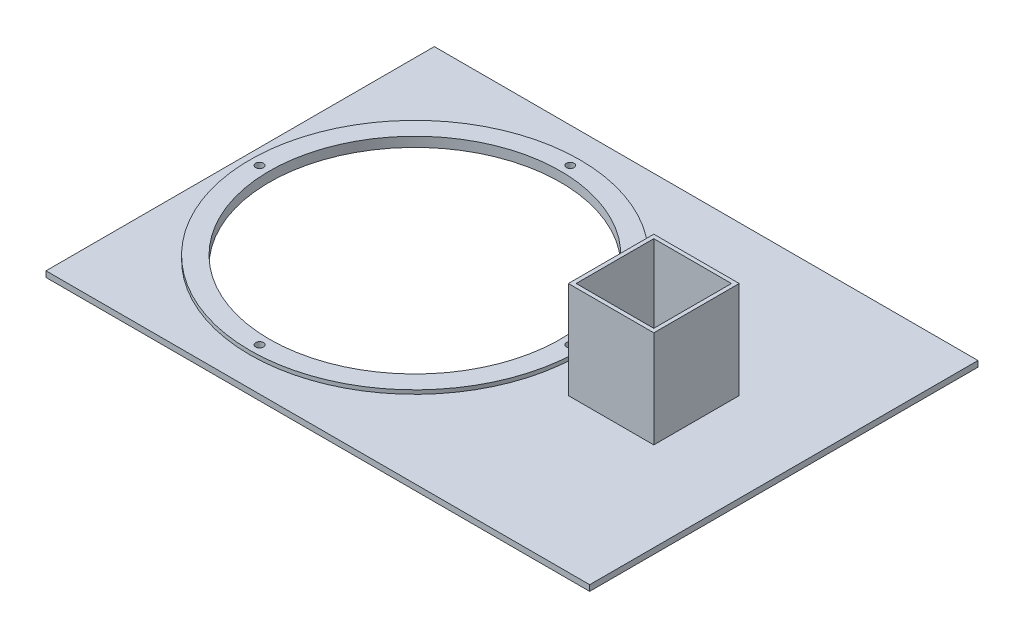
ISO-10303-21;
HEADER;
FILE_DESCRIPTION(('STEP AP214'),'2;1');
FILE_NAME('part.step','',(''),(''),'','','');
FILE_SCHEMA(('AUTOMOTIVE_DESIGN { 1 0 10303 214 1 1 1 1 }'));
ENDSEC;
DATA;
#1=APPLICATION_CONTEXT('core data for automotive mechanical design processes');
#2=APPLICATION_PROTOCOL_DEFINITION('international standard','automotive_design',2000,#1);
#3=PRODUCT_CONTEXT('',#1,'mechanical');
#4=PRODUCT('Part','Part','',(#3));
#5=PRODUCT_RELATED_PRODUCT_CATEGORY('part','',(#4));
#6=PRODUCT_DEFINITION_FORMATION('','',#4);
#7=PRODUCT_DEFINITION_CONTEXT('part definition',#1,'design');
#8=PRODUCT_DEFINITION('design','',#6,#7);
#9=PRODUCT_DEFINITION_SHAPE('','',#8);
#10=(LENGTH_UNIT() NAMED_UNIT(*) SI_UNIT(.MILLI.,.METRE.));
#11=(NAMED_UNIT(*) PLANE_ANGLE_UNIT() SI_UNIT($,.RADIAN.));
#12=(NAMED_UNIT(*) SI_UNIT($,.STERADIAN.) SOLID_ANGLE_UNIT());
#13=UNCERTAINTY_MEASURE_WITH_UNIT(LENGTH_MEASURE(1.E-05),#10,'distance_accuracy_value','');
#14=(GEOMETRIC_REPRESENTATION_CONTEXT(3) GLOBAL_UNCERTAINTY_ASSIGNED_CONTEXT((#13)) GLOBAL_UNIT_ASSIGNED_CONTEXT((#10,
#11,#12)) REPRESENTATION_CONTEXT('',''));
#15=CARTESIAN_POINT('',(0.,0.,0.));
#16=DIRECTION('',(0.,0.,1.));
#17=DIRECTION('',(1.,0.,0.));
#18=AXIS2_PLACEMENT_3D('',#15,#16,#17);
#19=CARTESIAN_POINT('',(0.,3.,0.));
#20=DIRECTION('',(0.,1.,0.));
#21=DIRECTION('',(0.,0.,1.));
#22=AXIS2_PLACEMENT_3D('',#19,#20,#21);
#23=PLANE('',#22);
#24=DIRECTION('',(1.,0.,0.));
#25=VECTOR('',#24,1.);
#26=CARTESIAN_POINT('',(0.,3.,100.));
#27=LINE('',#26,#25);
#28=CARTESIAN_POINT('',(-140.,3.,100.));
#29=VERTEX_POINT('',#28);
#30=CARTESIAN_POINT('',(140.,3.,100.));
#31=VERTEX_POINT('',#30);
#32=EDGE_CURVE('E279',#29,#31,#27,.T.);
#33=ORIENTED_EDGE('',*,*,#32,.T.);
#34=DIRECTION('',(0.,0.,-1.));
#35=VECTOR('',#34,1.);
#36=CARTESIAN_POINT('',(140.,3.,0.));
#37=LINE('',#36,#35);
#38=CARTESIAN_POINT('',(140.,3.,-100.));
#39=VERTEX_POINT('',#38);
#40=EDGE_CURVE('E284',#31,#39,#37,.T.);
#41=ORIENTED_EDGE('',*,*,#40,.T.);
#42=DIRECTION('',(1.,0.,0.));
#43=VECTOR('',#42,1.);
#44=CARTESIAN_POINT('',(0.,3.,-100.));
#45=LINE('',#44,#43);
#46=CARTESIAN_POINT('',(-140.,3.,-100.));
#47=VERTEX_POINT('',#46);
#48=EDGE_CURVE('E287',#47,#39,#45,.T.);
#49=ORIENTED_EDGE('',*,*,#48,.F.);
#50=DIRECTION('',(0.,0.,-1.));
#51=VECTOR('',#50,1.);
#52=CARTESIAN_POINT('',(-140.,3.,0.));
#53=LINE('',#52,#51);
#54=EDGE_CURVE('E291',#29,#47,#53,.T.);
#55=ORIENTED_EDGE('',*,*,#54,.F.);
#56=EDGE_LOOP('',(#33,#41,#49,#55));
#57=FACE_BOUND('',#56,.T.);
#58=CARTESIAN_POINT('',(-50.,3.,0.));
#59=DIRECTION('',(0.,1.,0.));
#60=DIRECTION('',(0.,0.,1.));
#61=AXIS2_PLACEMENT_3D('',#58,#59,#60);
#62=CIRCLE('',#61,85.);
#63=CARTESIAN_POINT('',(-50.,3.,85.));
#64=VERTEX_POINT('',#63);
#65=EDGE_CURVE('E275',#64,#64,#62,.T.);
#66=ORIENTED_EDGE('',*,*,#65,.F.);
#67=EDGE_LOOP('',(#66));
#68=FACE_BOUND('',#67,.T.);
#69=DIRECTION('',(1.,0.,0.));
#70=VECTOR('',#69,1.);
#71=CARTESIAN_POINT('',(50.1750568641056,3.,21.151360474384));
#72=LINE('',#71,#70);
#73=CARTESIAN_POINT('',(50.1750568641056,3.,21.151360474384));
#74=VERTEX_POINT('',#73);
#75=CARTESIAN_POINT('',(94.1750568641056,3.,21.151360474384));
#76=VERTEX_POINT('',#75);
#77=EDGE_CURVE('E210',#74,#76,#72,.T.);
#78=ORIENTED_EDGE('',*,*,#77,.F.);
#79=DIRECTION('',(0.,0.,1.));
#80=VECTOR('',#79,1.);
#81=CARTESIAN_POINT('',(50.1750568641056,3.,21.151360474384));
#82=LINE('',#81,#80);
#83=CARTESIAN_POINT('',(50.1750568641056,3.,-22.848639525616));
#84=VERTEX_POINT('',#83);
#85=EDGE_CURVE('E158',#84,#74,#82,.T.);
#86=ORIENTED_EDGE('',*,*,#85,.F.);
#87=DIRECTION('',(-1.,0.,0.));
#88=VECTOR('',#87,1.);
#89=CARTESIAN_POINT('',(50.1750568641056,3.,-22.848639525616));
#90=LINE('',#89,#88);
#91=CARTESIAN_POINT('',(94.1750568641056,3.,-22.848639525616));
#92=VERTEX_POINT('',#91);
#93=EDGE_CURVE('E197',#92,#84,#90,.T.);
#94=ORIENTED_EDGE('',*,*,#93,.F.);
#95=DIRECTION('',(0.,0.,-1.));
#96=VECTOR('',#95,1.);
#97=CARTESIAN_POINT('',(94.1750568641056,3.,21.151360474384));
#98=LINE('',#97,#96);
#99=EDGE_CURVE('E213',#76,#92,#98,.T.);
#100=ORIENTED_EDGE('',*,*,#99,.F.);
#101=EDGE_LOOP('',(#78,#86,#94,#100));
#102=FACE_BOUND('',#101,.T.);
#103=ADVANCED_FACE('F47',(#57,#68,#102),#23,.T.);
#104=CARTESIAN_POINT('',(0.,3.,100.));
#105=DIRECTION('',(0.,0.,-1.));
#106=DIRECTION('',(-1.,0.,0.));
#107=AXIS2_PLACEMENT_3D('',#104,#105,#106);
#108=PLANE('',#107);
#109=DIRECTION('',(1.,0.,0.));
#110=VECTOR('',#109,1.);
#111=CARTESIAN_POINT('',(0.,0.,100.));
#112=LINE('',#111,#110);
#113=CARTESIAN_POINT('',(-140.,0.,100.));
#114=VERTEX_POINT('',#113);
#115=CARTESIAN_POINT('',(140.,0.,100.));
#116=VERTEX_POINT('',#115);
#117=EDGE_CURVE('E256',#114,#116,#112,.T.);
#118=ORIENTED_EDGE('',*,*,#117,.T.);
#119=DIRECTION('',(0.,-1.,0.));
#120=VECTOR('',#119,1.);
#121=CARTESIAN_POINT('',(140.,3.,100.));
#122=LINE('',#121,#120);
#123=EDGE_CURVE('E11',#31,#116,#122,.T.);
#124=ORIENTED_EDGE('',*,*,#123,.F.);
#125=ORIENTED_EDGE('',*,*,#32,.F.);
#126=DIRECTION('',(0.,-1.,0.));
#127=VECTOR('',#126,1.);
#128=CARTESIAN_POINT('',(-140.,3.,100.));
#129=LINE('',#128,#127);
#130=EDGE_CURVE('E295',#29,#114,#129,.T.);
#131=ORIENTED_EDGE('',*,*,#130,.T.);
#132=EDGE_LOOP('',(#118,#124,#125,#131));
#133=FACE_BOUND('',#132,.T.);
#134=ADVANCED_FACE('F49',(#133),#108,.F.);
#135=CARTESIAN_POINT('',(140.,3.,0.));
#136=DIRECTION('',(-1.,0.,0.));
#137=DIRECTION('',(0.,0.,1.));
#138=AXIS2_PLACEMENT_3D('',#135,#136,#137);
#139=PLANE('',#138);
#140=DIRECTION('',(0.,0.,-1.));
#141=VECTOR('',#140,1.);
#142=CARTESIAN_POINT('',(140.,0.,0.));
#143=LINE('',#142,#141);
#144=CARTESIAN_POINT('',(140.,0.,-100.));
#145=VERTEX_POINT('',#144);
#146=EDGE_CURVE('E299',#116,#145,#143,.T.);
#147=ORIENTED_EDGE('',*,*,#146,.T.);
#148=DIRECTION('',(0.,-1.,0.));
#149=VECTOR('',#148,1.);
#150=CARTESIAN_POINT('',(140.,3.,-100.));
#151=LINE('',#150,#149);
#152=EDGE_CURVE('E56',#39,#145,#151,.T.);
#153=ORIENTED_EDGE('',*,*,#152,.F.);
#154=ORIENTED_EDGE('',*,*,#40,.F.);
#155=ORIENTED_EDGE('',*,*,#123,.T.);
#156=EDGE_LOOP('',(#147,#153,#154,#155));
#157=FACE_BOUND('',#156,.T.);
#158=ADVANCED_FACE('F321',(#157),#139,.F.);
#159=CARTESIAN_POINT('',(0.,3.,-100.));
#160=DIRECTION('',(0.,0.,-1.));
#161=DIRECTION('',(-1.,0.,0.));
#162=AXIS2_PLACEMENT_3D('',#159,#160,#161);
#163=PLANE('',#162);
#164=DIRECTION('',(1.,0.,0.));
#165=VECTOR('',#164,1.);
#166=CARTESIAN_POINT('',(0.,0.,-100.));
#167=LINE('',#166,#165);
#168=CARTESIAN_POINT('',(-140.,0.,-100.));
#169=VERTEX_POINT('',#168);
#170=EDGE_CURVE('E303',#169,#145,#167,.T.);
#171=ORIENTED_EDGE('',*,*,#170,.F.);
#172=DIRECTION('',(0.,-1.,0.));
#173=VECTOR('',#172,1.);
#174=CARTESIAN_POINT('',(-140.,3.,-100.));
#175=LINE('',#174,#173);
#176=EDGE_CURVE('E312',#47,#169,#175,.T.);
#177=ORIENTED_EDGE('',*,*,#176,.F.);
#178=ORIENTED_EDGE('',*,*,#48,.T.);
#179=ORIENTED_EDGE('',*,*,#152,.T.);
#180=EDGE_LOOP('',(#171,#177,#178,#179));
#181=FACE_BOUND('',#180,.T.);
#182=ADVANCED_FACE('F318',(#181),#163,.T.);
#183=CARTESIAN_POINT('',(-140.,3.,0.));
#184=DIRECTION('',(-1.,0.,0.));
#185=DIRECTION('',(0.,0.,1.));
#186=AXIS2_PLACEMENT_3D('',#183,#184,#185);
#187=PLANE('',#186);
#188=DIRECTION('',(0.,0.,-1.));
#189=VECTOR('',#188,1.);
#190=CARTESIAN_POINT('',(-140.,0.,0.));
#191=LINE('',#190,#189);
#192=EDGE_CURVE('E280',#114,#169,#191,.T.);
#193=ORIENTED_EDGE('',*,*,#192,.F.);
#194=ORIENTED_EDGE('',*,*,#130,.F.);
#195=ORIENTED_EDGE('',*,*,#54,.T.);
#196=ORIENTED_EDGE('',*,*,#176,.T.);
#197=EDGE_LOOP('',(#193,#194,#195,#196));
#198=FACE_BOUND('',#197,.T.);
#199=ADVANCED_FACE('F329',(#198),#187,.T.);
#200=CARTESIAN_POINT('',(0.,0.,0.));
#201=DIRECTION('',(0.,1.,0.));
#202=DIRECTION('',(0.,0.,1.));
#203=AXIS2_PLACEMENT_3D('',#200,#201,#202);
#204=PLANE('',#203);
#205=CARTESIAN_POINT('',(72.1750568641056,0.,-0.848639525616));
#206=DIRECTION('',(0.,1.,0.));
#207=DIRECTION('',(0.,0.,1.));
#208=AXIS2_PLACEMENT_3D('',#205,#206,#207);
#209=CIRCLE('',#208,0.999999999999998);
#210=CARTESIAN_POINT('',(72.1750568641056,0.,0.151360474383998));
#211=VERTEX_POINT('',#210);
#212=EDGE_CURVE('E176',#211,#211,#209,.T.);
#213=ORIENTED_EDGE('',*,*,#212,.T.);
#214=EDGE_LOOP('',(#213));
#215=FACE_BOUND('',#214,.T.);
#216=ORIENTED_EDGE('',*,*,#117,.F.);
#217=ORIENTED_EDGE('',*,*,#192,.T.);
#218=ORIENTED_EDGE('',*,*,#170,.T.);
#219=ORIENTED_EDGE('',*,*,#146,.F.);
#220=EDGE_LOOP('',(#216,#217,#218,#219));
#221=FACE_BOUND('',#220,.T.);
#222=CARTESIAN_POINT('',(-129.999999999998,0.,1.4363510381088E-12));
#223=DIRECTION('',(0.,1.,0.));
#224=DIRECTION('',(0.,0.,1.));
#225=AXIS2_PLACEMENT_3D('',#222,#223,#224);
#226=CIRCLE('',#225,1.99999999999999);
#227=CARTESIAN_POINT('',(-129.999999999998,0.,2.00000000000143));
#228=VERTEX_POINT('',#227);
#229=EDGE_CURVE('E230',#228,#228,#226,.T.);
#230=ORIENTED_EDGE('',*,*,#229,.T.);
#231=EDGE_LOOP('',(#230));
#232=FACE_BOUND('',#231,.T.);
#233=CARTESIAN_POINT('',(30.0000000000023,0.,-1.96370697480575E-12));
#234=DIRECTION('',(0.,1.,0.));
#235=DIRECTION('',(0.,0.,1.));
#236=AXIS2_PLACEMENT_3D('',#233,#234,#235);
#237=CIRCLE('',#236,2.00000000000001);
#238=CARTESIAN_POINT('',(30.0000000000023,0.,1.99999999999804));
#239=VERTEX_POINT('',#238);
#240=EDGE_CURVE('E260',#239,#239,#237,.T.);
#241=ORIENTED_EDGE('',*,*,#240,.T.);
#242=EDGE_LOOP('',(#241));
#243=FACE_BOUND('',#242,.T.);
#244=CARTESIAN_POINT('',(-50.,0.,0.));
#245=DIRECTION('',(0.,1.,0.));
#246=DIRECTION('',(0.,0.,1.));
#247=AXIS2_PLACEMENT_3D('',#244,#245,#246);
#248=CIRCLE('',#247,75.);
#249=CARTESIAN_POINT('',(-50.,0.,75.0000000000001));
#250=VERTEX_POINT('',#249);
#251=EDGE_CURVE('E264',#250,#250,#248,.T.);
#252=ORIENTED_EDGE('',*,*,#251,.T.);
#253=EDGE_LOOP('',(#252));
#254=FACE_BOUND('',#253,.T.);
#255=CARTESIAN_POINT('',(-50.,0.,-80.));
#256=DIRECTION('',(0.,1.,0.));
#257=DIRECTION('',(0.,0.,1.));
#258=AXIS2_PLACEMENT_3D('',#255,#256,#257);
#259=CIRCLE('',#258,2.);
#260=CARTESIAN_POINT('',(-50.,0.,-78.));
#261=VERTEX_POINT('',#260);
#262=EDGE_CURVE('E268',#261,#261,#259,.T.);
#263=ORIENTED_EDGE('',*,*,#262,.T.);
#264=EDGE_LOOP('',(#263));
#265=FACE_BOUND('',#264,.T.);
#266=CARTESIAN_POINT('',(-50.,0.,80.));
#267=DIRECTION('',(0.,1.,0.));
#268=DIRECTION('',(0.,0.,1.));
#269=AXIS2_PLACEMENT_3D('',#266,#267,#268);
#270=CIRCLE('',#269,2.);
#271=CARTESIAN_POINT('',(-50.,0.,82.));
#272=VERTEX_POINT('',#271);
#273=EDGE_CURVE('E236',#272,#272,#270,.F.);
#274=ORIENTED_EDGE('',*,*,#273,.F.);
#275=EDGE_LOOP('',(#274));
#276=FACE_BOUND('',#275,.T.);
#277=ADVANCED_FACE('F325',(#215,#221,#232,#243,#254,#265,#276),#204,.F.);
#278=CARTESIAN_POINT('',(-50.,5.,-80.));
#279=DIRECTION('',(0.,-1.,0.));
#280=DIRECTION('',(0.,0.,-1.));
#281=AXIS2_PLACEMENT_3D('',#278,#279,#280);
#282=CYLINDRICAL_SURFACE('',#281,2.);
#283=CARTESIAN_POINT('',(-50.,5.,-80.));
#284=DIRECTION('',(0.,1.,0.));
#285=DIRECTION('',(0.,0.,1.));
#286=AXIS2_PLACEMENT_3D('',#283,#284,#285);
#287=CIRCLE('',#286,2.);
#288=CARTESIAN_POINT('',(-50.,5.,-78.));
#289=VERTEX_POINT('',#288);
#290=EDGE_CURVE('E248',#289,#289,#287,.T.);
#291=ORIENTED_EDGE('',*,*,#290,.T.);
#292=EDGE_LOOP('',(#291));
#293=FACE_BOUND('',#292,.T.);
#294=ORIENTED_EDGE('',*,*,#262,.F.);
#295=EDGE_LOOP('',(#294));
#296=FACE_BOUND('',#295,.T.);
#297=ADVANCED_FACE('F372',(#293,#296),#282,.F.);
#298=CARTESIAN_POINT('',(-50.,5.,0.));
#299=DIRECTION('',(0.,-1.,0.));
#300=DIRECTION('',(0.,0.,-1.));
#301=AXIS2_PLACEMENT_3D('',#298,#299,#300);
#302=CYLINDRICAL_SURFACE('',#301,75.);
#303=CARTESIAN_POINT('',(-50.,5.,0.));
#304=DIRECTION('',(0.,1.,0.));
#305=DIRECTION('',(0.,0.,1.));
#306=AXIS2_PLACEMENT_3D('',#303,#304,#305);
#307=CIRCLE('',#306,75.);
#308=CARTESIAN_POINT('',(-50.,5.,75.0000000000001));
#309=VERTEX_POINT('',#308);
#310=EDGE_CURVE('E244',#309,#309,#307,.T.);
#311=ORIENTED_EDGE('',*,*,#310,.T.);
#312=EDGE_LOOP('',(#311));
#313=FACE_BOUND('',#312,.T.);
#314=ORIENTED_EDGE('',*,*,#251,.F.);
#315=EDGE_LOOP('',(#314));
#316=FACE_BOUND('',#315,.T.);
#317=ADVANCED_FACE('F376',(#313,#316),#302,.F.);
#318=CARTESIAN_POINT('',(-50.,5.,0.));
#319=DIRECTION('',(0.,-1.,0.));
#320=DIRECTION('',(0.,0.,-1.));
#321=AXIS2_PLACEMENT_3D('',#318,#319,#320);
#322=CYLINDRICAL_SURFACE('',#321,85.);
#323=ORIENTED_EDGE('',*,*,#65,.T.);
#324=EDGE_LOOP('',(#323));
#325=FACE_BOUND('',#324,.T.);
#326=CARTESIAN_POINT('',(-50.,5.,0.));
#327=DIRECTION('',(0.,1.,0.));
#328=DIRECTION('',(0.,0.,1.));
#329=AXIS2_PLACEMENT_3D('',#326,#327,#328);
#330=CIRCLE('',#329,85.);
#331=CARTESIAN_POINT('',(-50.,5.,85.));
#332=VERTEX_POINT('',#331);
#333=EDGE_CURVE('E240',#332,#332,#330,.T.);
#334=ORIENTED_EDGE('',*,*,#333,.F.);
#335=EDGE_LOOP('',(#334));
#336=FACE_BOUND('',#335,.T.);
#337=ADVANCED_FACE('F404',(#325,#336),#322,.T.);
#338=CARTESIAN_POINT('',(30.0000000000023,5.,-1.96370697480575E-12));
#339=DIRECTION('',(0.,-1.,0.));
#340=DIRECTION('',(0.,0.,-1.));
#341=AXIS2_PLACEMENT_3D('',#338,#339,#340);
#342=CYLINDRICAL_SURFACE('',#341,2.00000000000001);
#343=CARTESIAN_POINT('',(30.0000000000023,5.,-1.96370697480575E-12));
#344=DIRECTION('',(0.,1.,0.));
#345=DIRECTION('',(0.,0.,1.));
#346=AXIS2_PLACEMENT_3D('',#343,#344,#345);
#347=CIRCLE('',#346,2.00000000000001);
#348=CARTESIAN_POINT('',(30.0000000000023,5.,1.99999999999804));
#349=VERTEX_POINT('',#348);
#350=EDGE_CURVE('E235',#349,#349,#347,.T.);
#351=ORIENTED_EDGE('',*,*,#350,.T.);
#352=EDGE_LOOP('',(#351));
#353=FACE_BOUND('',#352,.T.);
#354=ORIENTED_EDGE('',*,*,#240,.F.);
#355=EDGE_LOOP('',(#354));
#356=FACE_BOUND('',#355,.T.);
#357=ADVANCED_FACE('F413',(#353,#356),#342,.F.);
#358=CARTESIAN_POINT('',(-129.999999999998,5.,1.4363510381088E-12));
#359=DIRECTION('',(0.,-1.,0.));
#360=DIRECTION('',(0.,0.,-1.));
#361=AXIS2_PLACEMENT_3D('',#358,#359,#360);
#362=CYLINDRICAL_SURFACE('',#361,1.99999999999999);
#363=CARTESIAN_POINT('',(-129.999999999998,5.,1.4363510381088E-12));
#364=DIRECTION('',(0.,1.,0.));
#365=DIRECTION('',(0.,0.,1.));
#366=AXIS2_PLACEMENT_3D('',#363,#364,#365);
#367=CIRCLE('',#366,1.99999999999999);
#368=CARTESIAN_POINT('',(-129.999999999998,5.,2.00000000000143));
#369=VERTEX_POINT('',#368);
#370=EDGE_CURVE('E231',#369,#369,#367,.T.);
#371=ORIENTED_EDGE('',*,*,#370,.T.);
#372=EDGE_LOOP('',(#371));
#373=FACE_BOUND('',#372,.T.);
#374=ORIENTED_EDGE('',*,*,#229,.F.);
#375=EDGE_LOOP('',(#374));
#376=FACE_BOUND('',#375,.T.);
#377=ADVANCED_FACE('F422',(#373,#376),#362,.F.);
#378=CARTESIAN_POINT('',(-50.,5.,80.));
#379=DIRECTION('',(0.,-1.,0.));
#380=DIRECTION('',(0.,0.,-1.));
#381=AXIS2_PLACEMENT_3D('',#378,#379,#380);
#382=CYLINDRICAL_SURFACE('',#381,2.);
#383=CARTESIAN_POINT('',(-50.,5.,80.));
#384=DIRECTION('',(0.,1.,0.));
#385=DIRECTION('',(0.,0.,1.));
#386=AXIS2_PLACEMENT_3D('',#383,#384,#385);
#387=CIRCLE('',#386,2.);
#388=CARTESIAN_POINT('',(-50.,5.,82.));
#389=VERTEX_POINT('',#388);
#390=EDGE_CURVE('E252',#389,#389,#387,.F.);
#391=ORIENTED_EDGE('',*,*,#390,.F.);
#392=EDGE_LOOP('',(#391));
#393=FACE_BOUND('',#392,.T.);
#394=ORIENTED_EDGE('',*,*,#273,.T.);
#395=EDGE_LOOP('',(#394));
#396=FACE_BOUND('',#395,.T.);
#397=ADVANCED_FACE('F431',(#393,#396),#382,.F.);
#398=CARTESIAN_POINT('',(0.,5.,0.));
#399=DIRECTION('',(0.,1.,0.));
#400=DIRECTION('',(0.,0.,1.));
#401=AXIS2_PLACEMENT_3D('',#398,#399,#400);
#402=PLANE('',#401);
#403=ORIENTED_EDGE('',*,*,#370,.F.);
#404=EDGE_LOOP('',(#403));
#405=FACE_BOUND('',#404,.T.);
#406=ORIENTED_EDGE('',*,*,#350,.F.);
#407=EDGE_LOOP('',(#406));
#408=FACE_BOUND('',#407,.T.);
#409=ORIENTED_EDGE('',*,*,#333,.T.);
#410=EDGE_LOOP('',(#409));
#411=FACE_BOUND('',#410,.T.);
#412=ORIENTED_EDGE('',*,*,#310,.F.);
#413=EDGE_LOOP('',(#412));
#414=FACE_BOUND('',#413,.T.);
#415=ORIENTED_EDGE('',*,*,#290,.F.);
#416=EDGE_LOOP('',(#415));
#417=FACE_BOUND('',#416,.T.);
#418=ORIENTED_EDGE('',*,*,#390,.T.);
#419=EDGE_LOOP('',(#418));
#420=FACE_BOUND('',#419,.T.);
#421=ADVANCED_FACE('F439',(#405,#408,#411,#414,#417,#420),#402,.T.);
#422=CARTESIAN_POINT('',(0.,53.,0.));
#423=DIRECTION('',(0.,-1.,0.));
#424=DIRECTION('',(0.,0.,-1.));
#425=AXIS2_PLACEMENT_3D('',#422,#423,#424);
#426=PLANE('',#425);
#427=DIRECTION('',(0.,0.,1.));
#428=VECTOR('',#427,1.);
#429=CARTESIAN_POINT('',(50.1750568641056,53.,21.151360474384));
#430=LINE('',#429,#428);
#431=CARTESIAN_POINT('',(50.1750568641056,53.,-22.848639525616));
#432=VERTEX_POINT('',#431);
#433=CARTESIAN_POINT('',(50.1750568641056,53.,21.151360474384));
#434=VERTEX_POINT('',#433);
#435=EDGE_CURVE('E192',#432,#434,#430,.T.);
#436=ORIENTED_EDGE('',*,*,#435,.T.);
#437=DIRECTION('',(1.,0.,0.));
#438=VECTOR('',#437,1.);
#439=CARTESIAN_POINT('',(50.1750568641056,53.,21.151360474384));
#440=LINE('',#439,#438);
#441=CARTESIAN_POINT('',(94.1750568641056,53.,21.151360474384));
#442=VERTEX_POINT('',#441);
#443=EDGE_CURVE('E196',#434,#442,#440,.T.);
#444=ORIENTED_EDGE('',*,*,#443,.T.);
#445=DIRECTION('',(0.,0.,-1.));
#446=VECTOR('',#445,1.);
#447=CARTESIAN_POINT('',(94.1750568641056,53.,21.151360474384));
#448=LINE('',#447,#446);
#449=CARTESIAN_POINT('',(94.1750568641056,53.,-22.848639525616));
#450=VERTEX_POINT('',#449);
#451=EDGE_CURVE('E200',#442,#450,#448,.T.);
#452=ORIENTED_EDGE('',*,*,#451,.T.);
#453=DIRECTION('',(-1.,0.,0.));
#454=VECTOR('',#453,1.);
#455=CARTESIAN_POINT('',(50.1750568641056,53.,-22.848639525616));
#456=LINE('',#455,#454);
#457=EDGE_CURVE('E203',#450,#432,#456,.T.);
#458=ORIENTED_EDGE('',*,*,#457,.T.);
#459=EDGE_LOOP('',(#436,#444,#452,#458));
#460=FACE_BOUND('',#459,.T.);
#461=DIRECTION('',(0.,0.,-1.));
#462=VECTOR('',#461,1.);
#463=CARTESIAN_POINT('',(92.1750568641056,53.,19.151360474384));
#464=LINE('',#463,#462);
#465=CARTESIAN_POINT('',(92.1750568641056,53.,19.151360474384));
#466=VERTEX_POINT('',#465);
#467=CARTESIAN_POINT('',(92.1750568641056,53.,-20.848639525616));
#468=VERTEX_POINT('',#467);
#469=EDGE_CURVE('E139',#466,#468,#464,.T.);
#470=ORIENTED_EDGE('',*,*,#469,.F.);
#471=DIRECTION('',(1.,0.,0.));
#472=VECTOR('',#471,1.);
#473=CARTESIAN_POINT('',(52.1750568641056,53.,19.151360474384));
#474=LINE('',#473,#472);
#475=CARTESIAN_POINT('',(52.1750568641056,53.,19.151360474384));
#476=VERTEX_POINT('',#475);
#477=EDGE_CURVE('E168',#476,#466,#474,.T.);
#478=ORIENTED_EDGE('',*,*,#477,.F.);
#479=DIRECTION('',(0.,0.,1.));
#480=VECTOR('',#479,1.);
#481=CARTESIAN_POINT('',(52.1750568641056,53.,19.151360474384));
#482=LINE('',#481,#480);
#483=CARTESIAN_POINT('',(52.1750568641056,53.,-20.848639525616));
#484=VERTEX_POINT('',#483);
#485=EDGE_CURVE('E164',#484,#476,#482,.T.);
#486=ORIENTED_EDGE('',*,*,#485,.F.);
#487=DIRECTION('',(-1.,0.,0.));
#488=VECTOR('',#487,1.);
#489=CARTESIAN_POINT('',(52.1750568641056,53.,-20.848639525616));
#490=LINE('',#489,#488);
#491=EDGE_CURVE('E149',#468,#484,#490,.T.);
#492=ORIENTED_EDGE('',*,*,#491,.F.);
#493=EDGE_LOOP('',(#470,#478,#486,#492));
#494=FACE_BOUND('',#493,.T.);
#495=ADVANCED_FACE('F162',(#460,#494),#426,.F.);
#496=CARTESIAN_POINT('',(50.1750568641056,53.,21.151360474384));
#497=DIRECTION('',(1.,0.,0.));
#498=DIRECTION('',(0.,0.,-1.));
#499=AXIS2_PLACEMENT_3D('',#496,#497,#498);
#500=PLANE('',#499);
#501=ORIENTED_EDGE('',*,*,#85,.T.);
#502=DIRECTION('',(0.,-1.,0.));
#503=VECTOR('',#502,1.);
#504=CARTESIAN_POINT('',(50.1750568641056,53.,21.151360474384));
#505=LINE('',#504,#503);
#506=EDGE_CURVE('E227',#434,#74,#505,.T.);
#507=ORIENTED_EDGE('',*,*,#506,.F.);
#508=ORIENTED_EDGE('',*,*,#435,.F.);
#509=DIRECTION('',(0.,-1.,0.));
#510=VECTOR('',#509,1.);
#511=CARTESIAN_POINT('',(50.1750568641056,53.,-22.848639525616));
#512=LINE('',#511,#510);
#513=EDGE_CURVE('E206',#432,#84,#512,.T.);
#514=ORIENTED_EDGE('',*,*,#513,.T.);
#515=EDGE_LOOP('',(#501,#507,#508,#514));
#516=FACE_BOUND('',#515,.T.);
#517=ADVANCED_FACE('F462',(#516),#500,.F.);
#518=CARTESIAN_POINT('',(50.1750568641056,53.,21.151360474384));
#519=DIRECTION('',(0.,0.,-1.));
#520=DIRECTION('',(-1.,0.,0.));
#521=AXIS2_PLACEMENT_3D('',#518,#519,#520);
#522=PLANE('',#521);
#523=ORIENTED_EDGE('',*,*,#77,.T.);
#524=DIRECTION('',(0.,-1.,0.));
#525=VECTOR('',#524,1.);
#526=CARTESIAN_POINT('',(94.1750568641056,53.,21.151360474384));
#527=LINE('',#526,#525);
#528=EDGE_CURVE('E223',#442,#76,#527,.T.);
#529=ORIENTED_EDGE('',*,*,#528,.F.);
#530=ORIENTED_EDGE('',*,*,#443,.F.);
#531=ORIENTED_EDGE('',*,*,#506,.T.);
#532=EDGE_LOOP('',(#523,#529,#530,#531));
#533=FACE_BOUND('',#532,.T.);
#534=ADVANCED_FACE('F472',(#533),#522,.F.);
#535=CARTESIAN_POINT('',(94.1750568641056,53.,21.151360474384));
#536=DIRECTION('',(-1.,0.,0.));
#537=DIRECTION('',(0.,0.,1.));
#538=AXIS2_PLACEMENT_3D('',#535,#536,#537);
#539=PLANE('',#538);
#540=ORIENTED_EDGE('',*,*,#99,.T.);
#541=DIRECTION('',(0.,-1.,0.));
#542=VECTOR('',#541,1.);
#543=CARTESIAN_POINT('',(94.1750568641056,53.,-22.848639525616));
#544=LINE('',#543,#542);
#545=EDGE_CURVE('E63',#450,#92,#544,.T.);
#546=ORIENTED_EDGE('',*,*,#545,.F.);
#547=ORIENTED_EDGE('',*,*,#451,.F.);
#548=ORIENTED_EDGE('',*,*,#528,.T.);
#549=EDGE_LOOP('',(#540,#546,#547,#548));
#550=FACE_BOUND('',#549,.T.);
#551=ADVANCED_FACE('F482',(#550),#539,.F.);
#552=CARTESIAN_POINT('',(50.1750568641056,53.,-22.848639525616));
#553=DIRECTION('',(0.,0.,1.));
#554=DIRECTION('',(1.,0.,0.));
#555=AXIS2_PLACEMENT_3D('',#552,#553,#554);
#556=PLANE('',#555);
#557=ORIENTED_EDGE('',*,*,#93,.T.);
#558=ORIENTED_EDGE('',*,*,#513,.F.);
#559=ORIENTED_EDGE('',*,*,#457,.F.);
#560=ORIENTED_EDGE('',*,*,#545,.T.);
#561=EDGE_LOOP('',(#557,#558,#559,#560));
#562=FACE_BOUND('',#561,.T.);
#563=ADVANCED_FACE('F492',(#562),#556,.F.);
#564=CARTESIAN_POINT('',(92.1750568641056,53.,19.151360474384));
#565=DIRECTION('',(-1.,0.,0.));
#566=DIRECTION('',(0.,0.,1.));
#567=AXIS2_PLACEMENT_3D('',#564,#565,#566);
#568=PLANE('',#567);
#569=DIRECTION('',(0.,0.,-1.));
#570=VECTOR('',#569,1.);
#571=CARTESIAN_POINT('',(92.1750568641056,3.,19.151360474384));
#572=LINE('',#571,#570);
#573=CARTESIAN_POINT('',(92.1750568641056,3.,19.151360474384));
#574=VERTEX_POINT('',#573);
#575=CARTESIAN_POINT('',(92.1750568641056,3.,-20.848639525616));
#576=VERTEX_POINT('',#575);
#577=EDGE_CURVE('E71',#574,#576,#572,.T.);
#578=ORIENTED_EDGE('',*,*,#577,.F.);
#579=DIRECTION('',(0.,-1.,0.));
#580=VECTOR('',#579,1.);
#581=CARTESIAN_POINT('',(92.1750568641056,53.,19.151360474384));
#582=LINE('',#581,#580);
#583=EDGE_CURVE('E144',#466,#574,#582,.T.);
#584=ORIENTED_EDGE('',*,*,#583,.F.);
#585=ORIENTED_EDGE('',*,*,#469,.T.);
#586=DIRECTION('',(0.,-1.,0.));
#587=VECTOR('',#586,1.);
#588=CARTESIAN_POINT('',(92.1750568641056,53.,-20.848639525616));
#589=LINE('',#588,#587);
#590=EDGE_CURVE('E142',#468,#576,#589,.T.);
#591=ORIENTED_EDGE('',*,*,#590,.T.);
#592=EDGE_LOOP('',(#578,#584,#585,#591));
#593=FACE_BOUND('',#592,.T.);
#594=ADVANCED_FACE('F141',(#593),#568,.T.);
#595=CARTESIAN_POINT('',(52.1750568641056,53.,-20.848639525616));
#596=DIRECTION('',(0.,0.,1.));
#597=DIRECTION('',(1.,0.,0.));
#598=AXIS2_PLACEMENT_3D('',#595,#596,#597);
#599=PLANE('',#598);
#600=DIRECTION('',(-1.,0.,0.));
#601=VECTOR('',#600,1.);
#602=CARTESIAN_POINT('',(52.1750568641056,3.,-20.848639525616));
#603=LINE('',#602,#601);
#604=CARTESIAN_POINT('',(52.1750568641056,3.,-20.848639525616));
#605=VERTEX_POINT('',#604);
#606=EDGE_CURVE('E156',#576,#605,#603,.T.);
#607=ORIENTED_EDGE('',*,*,#606,.F.);
#608=ORIENTED_EDGE('',*,*,#590,.F.);
#609=ORIENTED_EDGE('',*,*,#491,.T.);
#610=DIRECTION('',(0.,-1.,0.));
#611=VECTOR('',#610,1.);
#612=CARTESIAN_POINT('',(52.1750568641056,53.,-20.848639525616));
#613=LINE('',#612,#611);
#614=EDGE_CURVE('E159',#484,#605,#613,.T.);
#615=ORIENTED_EDGE('',*,*,#614,.T.);
#616=EDGE_LOOP('',(#607,#608,#609,#615));
#617=FACE_BOUND('',#616,.T.);
#618=ADVANCED_FACE('F153',(#617),#599,.T.);
#619=CARTESIAN_POINT('',(52.1750568641056,53.,19.151360474384));
#620=DIRECTION('',(1.,0.,0.));
#621=DIRECTION('',(0.,0.,-1.));
#622=AXIS2_PLACEMENT_3D('',#619,#620,#621);
#623=PLANE('',#622);
#624=DIRECTION('',(0.,0.,1.));
#625=VECTOR('',#624,1.);
#626=CARTESIAN_POINT('',(52.1750568641056,3.,19.151360474384));
#627=LINE('',#626,#625);
#628=CARTESIAN_POINT('',(52.1750568641056,3.,19.151360474384));
#629=VERTEX_POINT('',#628);
#630=EDGE_CURVE('E179',#605,#629,#627,.T.);
#631=ORIENTED_EDGE('',*,*,#630,.F.);
#632=ORIENTED_EDGE('',*,*,#614,.F.);
#633=ORIENTED_EDGE('',*,*,#485,.T.);
#634=DIRECTION('',(0.,-1.,0.));
#635=VECTOR('',#634,1.);
#636=CARTESIAN_POINT('',(52.1750568641056,53.,19.151360474384));
#637=LINE('',#636,#635);
#638=EDGE_CURVE('E186',#476,#629,#637,.T.);
#639=ORIENTED_EDGE('',*,*,#638,.T.);
#640=EDGE_LOOP('',(#631,#632,#633,#639));
#641=FACE_BOUND('',#640,.T.);
#642=ADVANCED_FACE('F359',(#641),#623,.T.);
#643=CARTESIAN_POINT('',(52.1750568641056,53.,19.151360474384));
#644=DIRECTION('',(0.,0.,-1.));
#645=DIRECTION('',(-1.,0.,0.));
#646=AXIS2_PLACEMENT_3D('',#643,#644,#645);
#647=PLANE('',#646);
#648=DIRECTION('',(1.,0.,0.));
#649=VECTOR('',#648,1.);
#650=CARTESIAN_POINT('',(52.1750568641056,3.,19.151360474384));
#651=LINE('',#650,#649);
#652=EDGE_CURVE('E150',#629,#574,#651,.T.);
#653=ORIENTED_EDGE('',*,*,#652,.F.);
#654=ORIENTED_EDGE('',*,*,#638,.F.);
#655=ORIENTED_EDGE('',*,*,#477,.T.);
#656=ORIENTED_EDGE('',*,*,#583,.T.);
#657=EDGE_LOOP('',(#653,#654,#655,#656));
#658=FACE_BOUND('',#657,.T.);
#659=ADVANCED_FACE('F350',(#658),#647,.T.);
#660=CARTESIAN_POINT('',(72.1750568641056,3.,-0.848639525616));
#661=DIRECTION('',(0.,1.,0.));
#662=DIRECTION('',(0.,0.,1.));
#663=AXIS2_PLACEMENT_3D('',#660,#661,#662);
#664=CIRCLE('',#663,0.999999999999998);
#665=CARTESIAN_POINT('',(72.1750568641056,3.,0.151360474383998));
#666=VERTEX_POINT('',#665);
#667=EDGE_CURVE('E364',#666,#666,#664,.T.);
#668=ORIENTED_EDGE('',*,*,#667,.F.);
#669=EDGE_LOOP('',(#668));
#670=FACE_BOUND('',#669,.T.);
#671=ORIENTED_EDGE('',*,*,#577,.T.);
#672=ORIENTED_EDGE('',*,*,#606,.T.);
#673=ORIENTED_EDGE('',*,*,#630,.T.);
#674=ORIENTED_EDGE('',*,*,#652,.T.);
#675=EDGE_LOOP('',(#671,#672,#673,#674));
#676=FACE_BOUND('',#675,.T.);
#677=ADVANCED_FACE('F341',(#670,#676),#23,.T.);
#678=CARTESIAN_POINT('',(72.1750568641056,-47.,-0.848639525616));
#679=DIRECTION('',(0.,1.,0.));
#680=DIRECTION('',(0.,0.,1.));
#681=AXIS2_PLACEMENT_3D('',#678,#679,#680);
#682=CYLINDRICAL_SURFACE('',#681,0.999999999999998);
#683=ORIENTED_EDGE('',*,*,#667,.T.);
#684=EDGE_LOOP('',(#683));
#685=FACE_BOUND('',#684,.T.);
#686=ORIENTED_EDGE('',*,*,#212,.F.);
#687=EDGE_LOOP('',(#686));
#688=FACE_BOUND('',#687,.T.);
#689=ADVANCED_FACE('F349',(#685,#688),#682,.F.);
#690=CLOSED_SHELL('',(#103,#134,#158,#182,#199,#277,#297,#317,#337,#357,#377,#397,#421,#495,
#517,#534,#551,#563,#594,#618,#642,#659,#677,#689));
#691=MANIFOLD_SOLID_BREP('B2',#690);
#692=ADVANCED_BREP_SHAPE_REPRESENTATION('',(#18,#691),#14);
#693=SHAPE_DEFINITION_REPRESENTATION(#9,#692);
ENDSEC;
END-ISO-10303-21;
